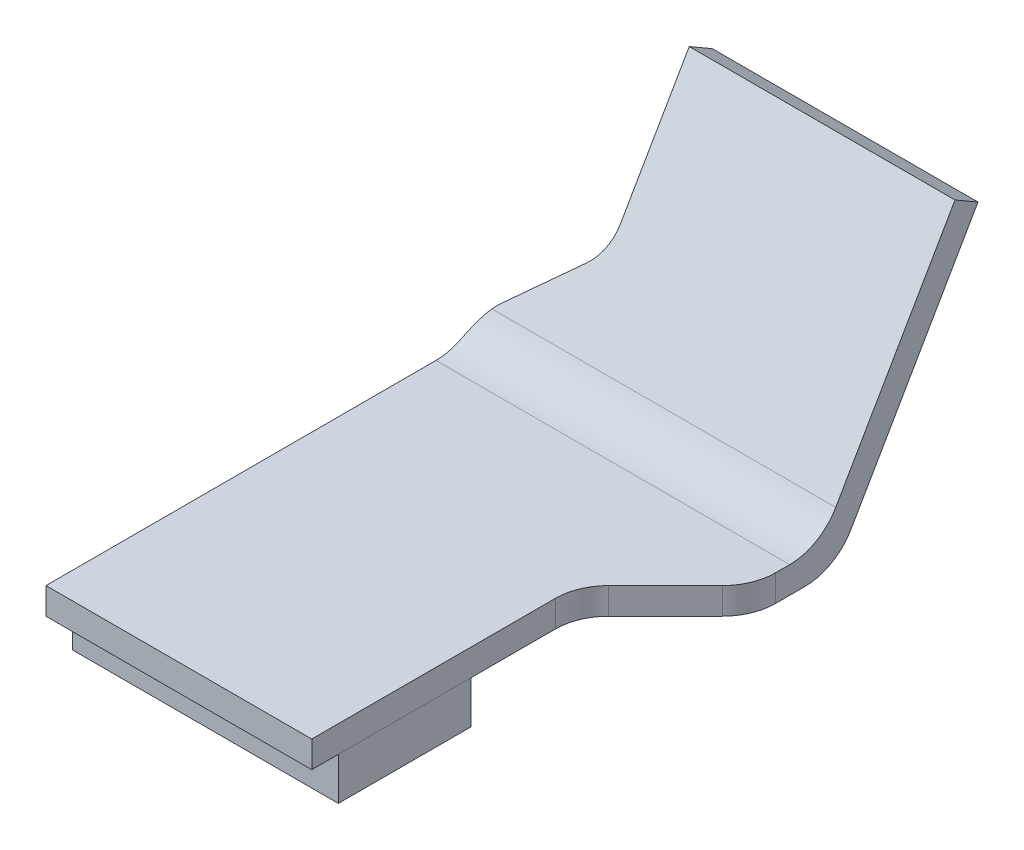
ISO-10303-21;
HEADER;
FILE_DESCRIPTION(('STEP AP214'),'2;1');
FILE_NAME('part.step','',(''),(''),'','','');
FILE_SCHEMA(('AUTOMOTIVE_DESIGN { 1 0 10303 214 1 1 1 1 }'));
ENDSEC;
DATA;
#1=APPLICATION_CONTEXT('core data for automotive mechanical design processes');
#2=APPLICATION_PROTOCOL_DEFINITION('international standard','automotive_design',2000,#1);
#3=PRODUCT_CONTEXT('',#1,'mechanical');
#4=PRODUCT('Part','Part','',(#3));
#5=PRODUCT_RELATED_PRODUCT_CATEGORY('part','',(#4));
#6=PRODUCT_DEFINITION_FORMATION('','',#4);
#7=PRODUCT_DEFINITION_CONTEXT('part definition',#1,'design');
#8=PRODUCT_DEFINITION('design','',#6,#7);
#9=PRODUCT_DEFINITION_SHAPE('','',#8);
#10=(LENGTH_UNIT() NAMED_UNIT(*) SI_UNIT(.MILLI.,.METRE.));
#11=(NAMED_UNIT(*) PLANE_ANGLE_UNIT() SI_UNIT($,.RADIAN.));
#12=(NAMED_UNIT(*) SI_UNIT($,.STERADIAN.) SOLID_ANGLE_UNIT());
#13=UNCERTAINTY_MEASURE_WITH_UNIT(LENGTH_MEASURE(1.E-05),#10,'distance_accuracy_value','');
#14=(GEOMETRIC_REPRESENTATION_CONTEXT(3) GLOBAL_UNCERTAINTY_ASSIGNED_CONTEXT((#13)) GLOBAL_UNIT_ASSIGNED_CONTEXT((#10,
#11,#12)) REPRESENTATION_CONTEXT('',''));
#15=CARTESIAN_POINT('',(0.,0.,0.));
#16=DIRECTION('',(0.,0.,1.));
#17=DIRECTION('',(1.,0.,0.));
#18=AXIS2_PLACEMENT_3D('',#15,#16,#17);
#19=CARTESIAN_POINT('',(0.,-1.6,15.4065524));
#20=DIRECTION('',(1.,0.,0.));
#21=DIRECTION('',(0.,0.,-1.));
#22=AXIS2_PLACEMENT_3D('',#19,#20,#21);
#23=PLANE('',#22);
#24=DIRECTION('',(0.,0.,-1.));
#25=VECTOR('',#24,1.);
#26=CARTESIAN_POINT('',(0.,0.,15.4065524));
#27=LINE('',#26,#25);
#28=CARTESIAN_POINT('',(0.,0.,15.4065524));
#29=VERTEX_POINT('',#28);
#30=CARTESIAN_POINT('',(0.,0.,10.4065524));
#31=VERTEX_POINT('',#30);
#32=EDGE_CURVE('E114',#29,#31,#27,.T.);
#33=ORIENTED_EDGE('',*,*,#32,.T.);
#34=DIRECTION('',(0.,1.,0.));
#35=VECTOR('',#34,1.);
#36=CARTESIAN_POINT('',(0.,-1.6,10.4065524));
#37=LINE('',#36,#35);
#38=CARTESIAN_POINT('',(0.,-1.6,10.4065524));
#39=VERTEX_POINT('',#38);
#40=EDGE_CURVE('E12',#39,#31,#37,.T.);
#41=ORIENTED_EDGE('',*,*,#40,.F.);
#42=DIRECTION('',(0.,0.,-1.));
#43=VECTOR('',#42,1.);
#44=CARTESIAN_POINT('',(0.,-1.6,15.4065524));
#45=LINE('',#44,#43);
#46=CARTESIAN_POINT('',(0.,-1.6,15.4065524));
#47=VERTEX_POINT('',#46);
#48=EDGE_CURVE('E102',#47,#39,#45,.T.);
#49=ORIENTED_EDGE('',*,*,#48,.F.);
#50=DIRECTION('',(0.,1.,0.));
#51=VECTOR('',#50,1.);
#52=CARTESIAN_POINT('',(0.,-1.6,15.4065524));
#53=LINE('',#52,#51);
#54=EDGE_CURVE('E110',#47,#29,#53,.T.);
#55=ORIENTED_EDGE('',*,*,#54,.T.);
#56=EDGE_LOOP('',(#33,#41,#49,#55));
#57=FACE_BOUND('',#56,.T.);
#58=ADVANCED_FACE('F51',(#57),#23,.F.);
#59=CARTESIAN_POINT('',(0.,-1.6,10.4065524));
#60=DIRECTION('',(0.,0.,1.));
#61=DIRECTION('',(1.,0.,0.));
#62=AXIS2_PLACEMENT_3D('',#59,#60,#61);
#63=PLANE('',#62);
#64=DIRECTION('',(1.,0.,0.));
#65=VECTOR('',#64,1.);
#66=CARTESIAN_POINT('',(0.,0.,10.4065524));
#67=LINE('',#66,#65);
#68=CARTESIAN_POINT('',(10.,0.,10.4065524));
#69=VERTEX_POINT('',#68);
#70=EDGE_CURVE('E106',#31,#69,#67,.T.);
#71=ORIENTED_EDGE('',*,*,#70,.T.);
#72=DIRECTION('',(0.,1.,0.));
#73=VECTOR('',#72,1.);
#74=CARTESIAN_POINT('',(10.,-1.6,10.4065524));
#75=LINE('',#74,#73);
#76=CARTESIAN_POINT('',(10.,-1.6,10.4065524));
#77=VERTEX_POINT('',#76);
#78=EDGE_CURVE('E59',#77,#69,#75,.T.);
#79=ORIENTED_EDGE('',*,*,#78,.F.);
#80=DIRECTION('',(1.,0.,0.));
#81=VECTOR('',#80,1.);
#82=CARTESIAN_POINT('',(0.,-1.6,10.4065524));
#83=LINE('',#82,#81);
#84=EDGE_CURVE('E97',#39,#77,#83,.T.);
#85=ORIENTED_EDGE('',*,*,#84,.F.);
#86=ORIENTED_EDGE('',*,*,#40,.T.);
#87=EDGE_LOOP('',(#71,#79,#85,#86));
#88=FACE_BOUND('',#87,.T.);
#89=ADVANCED_FACE('F105',(#88),#63,.F.);
#90=CARTESIAN_POINT('',(10.,-1.6,15.4065524));
#91=DIRECTION('',(-1.,0.,0.));
#92=DIRECTION('',(0.,0.,1.));
#93=AXIS2_PLACEMENT_3D('',#90,#91,#92);
#94=PLANE('',#93);
#95=DIRECTION('',(0.,0.,1.));
#96=VECTOR('',#95,1.);
#97=CARTESIAN_POINT('',(10.,0.,15.4065524));
#98=LINE('',#97,#96);
#99=CARTESIAN_POINT('',(10.,0.,15.4065524));
#100=VERTEX_POINT('',#99);
#101=EDGE_CURVE('E84',#69,#100,#98,.T.);
#102=ORIENTED_EDGE('',*,*,#101,.T.);
#103=DIRECTION('',(0.,1.,0.));
#104=VECTOR('',#103,1.);
#105=CARTESIAN_POINT('',(10.,-1.6,15.4065524));
#106=LINE('',#105,#104);
#107=CARTESIAN_POINT('',(10.,-1.6,15.4065524));
#108=VERTEX_POINT('',#107);
#109=EDGE_CURVE('E107',#108,#100,#106,.T.);
#110=ORIENTED_EDGE('',*,*,#109,.F.);
#111=DIRECTION('',(0.,0.,1.));
#112=VECTOR('',#111,1.);
#113=CARTESIAN_POINT('',(10.,-1.6,15.4065524));
#114=LINE('',#113,#112);
#115=EDGE_CURVE('E100',#77,#108,#114,.T.);
#116=ORIENTED_EDGE('',*,*,#115,.F.);
#117=ORIENTED_EDGE('',*,*,#78,.T.);
#118=EDGE_LOOP('',(#102,#110,#116,#117));
#119=FACE_BOUND('',#118,.T.);
#120=ADVANCED_FACE('F108',(#119),#94,.F.);
#121=CARTESIAN_POINT('',(0.,-1.6,15.4065524));
#122=DIRECTION('',(0.,0.,-1.));
#123=DIRECTION('',(-1.,0.,0.));
#124=AXIS2_PLACEMENT_3D('',#121,#122,#123);
#125=PLANE('',#124);
#126=DIRECTION('',(-1.,0.,0.));
#127=VECTOR('',#126,1.);
#128=CARTESIAN_POINT('',(0.,0.,15.4065524));
#129=LINE('',#128,#127);
#130=EDGE_CURVE('E90',#100,#29,#129,.T.);
#131=ORIENTED_EDGE('',*,*,#130,.T.);
#132=ORIENTED_EDGE('',*,*,#54,.F.);
#133=DIRECTION('',(-1.,0.,0.));
#134=VECTOR('',#133,1.);
#135=CARTESIAN_POINT('',(0.,-1.6,15.4065524));
#136=LINE('',#135,#134);
#137=EDGE_CURVE('E67',#108,#47,#136,.T.);
#138=ORIENTED_EDGE('',*,*,#137,.F.);
#139=ORIENTED_EDGE('',*,*,#109,.T.);
#140=EDGE_LOOP('',(#131,#132,#138,#139));
#141=FACE_BOUND('',#140,.T.);
#142=ADVANCED_FACE('F121',(#141),#125,.F.);
#143=CARTESIAN_POINT('',(0.,-1.6,0.));
#144=DIRECTION('',(0.,-1.,0.));
#145=DIRECTION('',(0.,0.,-1.));
#146=AXIS2_PLACEMENT_3D('',#143,#144,#145);
#147=PLANE('',#146);
#148=ORIENTED_EDGE('',*,*,#48,.T.);
#149=ORIENTED_EDGE('',*,*,#84,.T.);
#150=ORIENTED_EDGE('',*,*,#115,.T.);
#151=ORIENTED_EDGE('',*,*,#137,.T.);
#152=EDGE_LOOP('',(#148,#149,#150,#151));
#153=FACE_BOUND('',#152,.T.);
#154=ADVANCED_FACE('F98',(#153),#147,.T.);
#155=CARTESIAN_POINT('',(0.,0.,0.));
#156=DIRECTION('',(0.,-1.,0.));
#157=DIRECTION('',(0.,0.,-1.));
#158=AXIS2_PLACEMENT_3D('',#155,#156,#157);
#159=PLANE('',#158);
#160=ORIENTED_EDGE('',*,*,#32,.F.);
#161=ORIENTED_EDGE('',*,*,#130,.F.);
#162=ORIENTED_EDGE('',*,*,#101,.F.);
#163=ORIENTED_EDGE('',*,*,#70,.F.);
#164=EDGE_LOOP('',(#160,#161,#162,#163));
#165=FACE_BOUND('',#164,.T.);
#166=ADVANCED_FACE('F124',(#165),#159,.F.);
#167=CLOSED_SHELL('',(#58,#89,#120,#142,#154,#166));
#168=MANIFOLD_SOLID_BREP('B2',#167);
#169=CARTESIAN_POINT('',(13.31,0.999999999999998,0.57735026918963));
#170=DIRECTION('',(0.,-1.,0.));
#171=DIRECTION('',(0.,0.,-1.));
#172=AXIS2_PLACEMENT_3D('',#169,#170,#171);
#173=PLANE('',#172);
#174=DIRECTION('',(0.707106781186543,0.,-0.707106781186552));
#175=VECTOR('',#174,1.);
#176=CARTESIAN_POINT('',(10.,0.999999999999997,6.4065524));
#177=LINE('',#176,#175);
#178=CARTESIAN_POINT('',(10.5857864376269,0.999999999999997,5.8207659623731));
#179=VERTEX_POINT('',#178);
#180=CARTESIAN_POINT('',(12.7242135623731,0.999999999999998,3.68233883762687));
#181=VERTEX_POINT('',#180);
#182=EDGE_CURVE('E451',#179,#181,#177,.T.);
#183=ORIENTED_EDGE('',*,*,#182,.T.);
#184=CARTESIAN_POINT('',(11.31,0.999999999999997,2.26812527525378));
#185=DIRECTION('',(0.,-1.,0.));
#186=DIRECTION('',(0.,0.,-1.));
#187=AXIS2_PLACEMENT_3D('',#184,#185,#186);
#188=CIRCLE('',#187,2.);
#189=CARTESIAN_POINT('',(13.31,0.999999999999997,2.26812527525378));
#190=VERTEX_POINT('',#189);
#191=EDGE_CURVE('E190',#181,#190,#188,.F.);
#192=ORIENTED_EDGE('',*,*,#191,.T.);
#193=DIRECTION('',(0.,0.,1.));
#194=VECTOR('',#193,1.);
#195=CARTESIAN_POINT('',(13.31,0.999999999999998,0.57735026918963));
#196=LINE('',#195,#194);
#197=CARTESIAN_POINT('',(13.31,0.999999999999997,1.73205080756889));
#198=VERTEX_POINT('',#197);
#199=EDGE_CURVE('E476',#198,#190,#196,.T.);
#200=ORIENTED_EDGE('',*,*,#199,.F.);
#201=DIRECTION('',(-1.,0.,0.));
#202=VECTOR('',#201,1.);
#203=CARTESIAN_POINT('',(0.,0.999999999999997,1.73205080756889));
#204=LINE('',#203,#202);
#205=CARTESIAN_POINT('',(0.,0.999999999999997,1.73205080756889));
#206=VERTEX_POINT('',#205);
#207=EDGE_CURVE('E320',#198,#206,#204,.T.);
#208=ORIENTED_EDGE('',*,*,#207,.T.);
#209=DIRECTION('',(0.,0.,1.));
#210=VECTOR('',#209,1.);
#211=CARTESIAN_POINT('',(0.,0.999999999999998,0.57735026918963));
#212=LINE('',#211,#210);
#213=CARTESIAN_POINT('',(0.,0.999999999999996,16.4065524));
#214=VERTEX_POINT('',#213);
#215=EDGE_CURVE('E457',#206,#214,#212,.T.);
#216=ORIENTED_EDGE('',*,*,#215,.T.);
#217=DIRECTION('',(-1.,0.,0.));
#218=VECTOR('',#217,1.);
#219=CARTESIAN_POINT('',(13.31,0.999999999999996,16.4065524));
#220=LINE('',#219,#218);
#221=CARTESIAN_POINT('',(10.,0.999999999999999,16.4065524));
#222=VERTEX_POINT('',#221);
#223=EDGE_CURVE('E321',#222,#214,#220,.T.);
#224=ORIENTED_EDGE('',*,*,#223,.F.);
#225=DIRECTION('',(0.,0.,-1.));
#226=VECTOR('',#225,1.);
#227=CARTESIAN_POINT('',(10.,0.999999999999996,16.4065524));
#228=LINE('',#227,#226);
#229=CARTESIAN_POINT('',(10.,0.999999999999997,7.23497952474619));
#230=VERTEX_POINT('',#229);
#231=EDGE_CURVE('E453',#222,#230,#228,.T.);
#232=ORIENTED_EDGE('',*,*,#231,.T.);
#233=CARTESIAN_POINT('',(12.,0.999999999999997,7.23497952474619));
#234=DIRECTION('',(0.,-1.,0.));
#235=DIRECTION('',(0.,0.,-1.));
#236=AXIS2_PLACEMENT_3D('',#233,#234,#235);
#237=CIRCLE('',#236,2.);
#238=EDGE_CURVE('E49',#230,#179,#237,.T.);
#239=ORIENTED_EDGE('',*,*,#238,.T.);
#240=EDGE_LOOP('',(#183,#192,#200,#208,#216,#224,#232,#239));
#241=FACE_BOUND('',#240,.T.);
#242=ADVANCED_FACE('F174',(#241),#173,.F.);
#243=CARTESIAN_POINT('',(13.31,0.,16.4065524));
#244=DIRECTION('',(0.,0.,-1.));
#245=DIRECTION('',(-1.,0.,0.));
#246=AXIS2_PLACEMENT_3D('',#243,#244,#245);
#247=PLANE('',#246);
#248=DIRECTION('',(0.,-1.,0.));
#249=VECTOR('',#248,1.);
#250=CARTESIAN_POINT('',(10.,14.7154001035333,16.4065524));
#251=LINE('',#250,#249);
#252=CARTESIAN_POINT('',(10.,0.,16.4065524));
#253=VERTEX_POINT('',#252);
#254=EDGE_CURVE('E444',#222,#253,#251,.T.);
#255=ORIENTED_EDGE('',*,*,#254,.F.);
#256=ORIENTED_EDGE('',*,*,#223,.T.);
#257=DIRECTION('',(0.,-1.,0.));
#258=VECTOR('',#257,1.);
#259=CARTESIAN_POINT('',(0.,0.,16.4065524));
#260=LINE('',#259,#258);
#261=CARTESIAN_POINT('',(0.,0.,16.4065524));
#262=VERTEX_POINT('',#261);
#263=EDGE_CURVE('E461',#214,#262,#260,.T.);
#264=ORIENTED_EDGE('',*,*,#263,.T.);
#265=DIRECTION('',(-1.,0.,0.));
#266=VECTOR('',#265,1.);
#267=CARTESIAN_POINT('',(13.31,0.,16.4065524));
#268=LINE('',#267,#266);
#269=EDGE_CURVE('E329',#253,#262,#268,.T.);
#270=ORIENTED_EDGE('',*,*,#269,.F.);
#271=EDGE_LOOP('',(#255,#256,#264,#270));
#272=FACE_BOUND('',#271,.T.);
#273=ADVANCED_FACE('F497',(#272),#247,.F.);
#274=CARTESIAN_POINT('',(13.31,0.,16.4065524));
#275=DIRECTION('',(0.,1.,0.));
#276=DIRECTION('',(0.,0.,1.));
#277=AXIS2_PLACEMENT_3D('',#274,#275,#276);
#278=PLANE('',#277);
#279=DIRECTION('',(0.,0.,-1.));
#280=VECTOR('',#279,1.);
#281=CARTESIAN_POINT('',(13.31,0.,16.4065524));
#282=LINE('',#281,#280);
#283=CARTESIAN_POINT('',(13.31,0.,2.26812527525378));
#284=VERTEX_POINT('',#283);
#285=CARTESIAN_POINT('',(13.31,0.,1.15470053837926));
#286=VERTEX_POINT('',#285);
#287=EDGE_CURVE('E479',#284,#286,#282,.T.);
#288=ORIENTED_EDGE('',*,*,#287,.F.);
#289=CARTESIAN_POINT('',(11.31,0.,2.26812527525378));
#290=DIRECTION('',(0.,1.,0.));
#291=DIRECTION('',(0.,0.,1.));
#292=AXIS2_PLACEMENT_3D('',#289,#290,#291);
#293=CIRCLE('',#292,2.);
#294=CARTESIAN_POINT('',(12.7242135623731,0.,3.68233883762687));
#295=VERTEX_POINT('',#294);
#296=EDGE_CURVE('E198',#284,#295,#293,.F.);
#297=ORIENTED_EDGE('',*,*,#296,.T.);
#298=DIRECTION('',(-0.707106781186543,0.,0.707106781186552));
#299=VECTOR('',#298,1.);
#300=CARTESIAN_POINT('',(10.,0.,6.4065524));
#301=LINE('',#300,#299);
#302=CARTESIAN_POINT('',(10.5857864376269,0.,5.8207659623731));
#303=VERTEX_POINT('',#302);
#304=EDGE_CURVE('E436',#295,#303,#301,.T.);
#305=ORIENTED_EDGE('',*,*,#304,.T.);
#306=CARTESIAN_POINT('',(12.,0.,7.23497952474619));
#307=DIRECTION('',(0.,1.,0.));
#308=DIRECTION('',(0.,0.,1.));
#309=AXIS2_PLACEMENT_3D('',#306,#307,#308);
#310=CIRCLE('',#309,2.);
#311=CARTESIAN_POINT('',(10.,0.,7.23497952474619));
#312=VERTEX_POINT('',#311);
#313=EDGE_CURVE('E183',#303,#312,#310,.T.);
#314=ORIENTED_EDGE('',*,*,#313,.T.);
#315=DIRECTION('',(0.,0.,1.));
#316=VECTOR('',#315,1.);
#317=CARTESIAN_POINT('',(10.,0.,16.4065524));
#318=LINE('',#317,#316);
#319=EDGE_CURVE('E433',#312,#253,#318,.T.);
#320=ORIENTED_EDGE('',*,*,#319,.T.);
#321=ORIENTED_EDGE('',*,*,#269,.T.);
#322=DIRECTION('',(0.,0.,-1.));
#323=VECTOR('',#322,1.);
#324=CARTESIAN_POINT('',(0.,0.,16.4065524));
#325=LINE('',#324,#323);
#326=CARTESIAN_POINT('',(0.,0.,1.15470053837926));
#327=VERTEX_POINT('',#326);
#328=EDGE_CURVE('E473',#262,#327,#325,.T.);
#329=ORIENTED_EDGE('',*,*,#328,.T.);
#330=DIRECTION('',(-1.,0.,0.));
#331=VECTOR('',#330,1.);
#332=CARTESIAN_POINT('',(13.31,0.,1.15470053837926));
#333=LINE('',#332,#331);
#334=EDGE_CURVE('E342',#327,#286,#333,.F.);
#335=ORIENTED_EDGE('',*,*,#334,.T.);
#336=EDGE_LOOP('',(#288,#297,#305,#314,#320,#321,#329,#335));
#337=FACE_BOUND('',#336,.T.);
#338=ADVANCED_FACE('F432',(#337),#278,.F.);
#339=CARTESIAN_POINT('',(13.31,0.,0.));
#340=DIRECTION('',(1.,0.,0.));
#341=DIRECTION('',(0.,0.,-1.));
#342=AXIS2_PLACEMENT_3D('',#339,#340,#341);
#343=PLANE('',#342);
#344=ORIENTED_EDGE('',*,*,#199,.T.);
#345=DIRECTION('',(0.,-1.,0.));
#346=VECTOR('',#345,1.);
#347=CARTESIAN_POINT('',(13.31,0.,2.26812527525378));
#348=LINE('',#347,#346);
#349=EDGE_CURVE('E415',#190,#284,#348,.T.);
#350=ORIENTED_EDGE('',*,*,#349,.T.);
#351=ORIENTED_EDGE('',*,*,#287,.T.);
#352=CARTESIAN_POINT('',(13.31,2.,1.15470053837926));
#353=DIRECTION('',(1.,0.,0.));
#354=DIRECTION('',(0.,0.,-1.));
#355=AXIS2_PLACEMENT_3D('',#352,#353,#354);
#356=CIRCLE('',#355,2.);
#357=CARTESIAN_POINT('',(13.31,1.00000000000001,-0.577350269189625));
#358=VERTEX_POINT('',#357);
#359=EDGE_CURVE('E346',#286,#358,#356,.T.);
#360=ORIENTED_EDGE('',*,*,#359,.T.);
#361=DIRECTION('',(0.,0.86602540378444,-0.499999999999997));
#362=VECTOR('',#361,1.);
#363=CARTESIAN_POINT('',(13.31,0.,0.));
#364=LINE('',#363,#362);
#365=CARTESIAN_POINT('',(13.31,9.27331342118341,-5.35394999999997));
#366=VERTEX_POINT('',#365);
#367=EDGE_CURVE('E482',#358,#366,#364,.T.);
#368=ORIENTED_EDGE('',*,*,#367,.T.);
#369=DIRECTION('',(0.,0.499999999999998,0.86602540378444));
#370=VECTOR('',#369,1.);
#371=CARTESIAN_POINT('',(13.31,9.27331342118341,-5.35394999999997));
#372=LINE('',#371,#370);
#373=CARTESIAN_POINT('',(13.31,9.77331342118341,-4.48792459621553));
#374=VERTEX_POINT('',#373);
#375=EDGE_CURVE('E470',#366,#374,#372,.T.);
#376=ORIENTED_EDGE('',*,*,#375,.T.);
#377=DIRECTION('',(0.,-0.86602540378444,0.499999999999997));
#378=VECTOR('',#377,1.);
#379=CARTESIAN_POINT('',(13.31,9.77331342118341,-4.48792459621553));
#380=LINE('',#379,#378);
#381=CARTESIAN_POINT('',(13.31,2.00000000000001,0.));
#382=VERTEX_POINT('',#381);
#383=EDGE_CURVE('E317',#374,#382,#380,.T.);
#384=ORIENTED_EDGE('',*,*,#383,.T.);
#385=CARTESIAN_POINT('',(13.31,3.,1.73205080756889));
#386=DIRECTION('',(1.,0.,0.));
#387=DIRECTION('',(0.,0.,-1.));
#388=AXIS2_PLACEMENT_3D('',#385,#386,#387);
#389=CIRCLE('',#388,2.);
#390=EDGE_CURVE('E353',#382,#198,#389,.F.);
#391=ORIENTED_EDGE('',*,*,#390,.T.);
#392=EDGE_LOOP('',(#344,#350,#351,#360,#368,#376,#384,#391));
#393=FACE_BOUND('',#392,.T.);
#394=ADVANCED_FACE('F527',(#393),#343,.T.);
#395=CARTESIAN_POINT('',(13.31,9.27331342118341,-5.35394999999997));
#396=DIRECTION('',(0.,-0.86602540378444,0.499999999999998));
#397=DIRECTION('',(0.,-0.499999999999998,-0.86602540378444));
#398=AXIS2_PLACEMENT_3D('',#395,#396,#397);
#399=PLANE('',#398);
#400=DIRECTION('',(-1.,0.,0.));
#401=VECTOR('',#400,1.);
#402=CARTESIAN_POINT('',(13.31,9.27331342118341,-5.35394999999997));
#403=LINE('',#402,#401);
#404=CARTESIAN_POINT('',(3.31,9.27331342118341,-5.35394999999998));
#405=VERTEX_POINT('',#404);
#406=EDGE_CURVE('E310',#366,#405,#403,.T.);
#407=ORIENTED_EDGE('',*,*,#406,.T.);
#408=DIRECTION('',(0.,0.499999999999997,0.86602540378444));
#409=VECTOR('',#408,1.);
#410=CARTESIAN_POINT('',(3.31,4.3328630368561,-13.9110610779281));
#411=LINE('',#410,#409);
#412=CARTESIAN_POINT('',(3.31,9.77331342118341,-4.48792459621553));
#413=VERTEX_POINT('',#412);
#414=EDGE_CURVE('E294',#405,#413,#411,.T.);
#415=ORIENTED_EDGE('',*,*,#414,.T.);
#416=DIRECTION('',(-1.,0.,0.));
#417=VECTOR('',#416,1.);
#418=CARTESIAN_POINT('',(13.31,9.77331342118341,-4.48792459621553));
#419=LINE('',#418,#417);
#420=EDGE_CURVE('E308',#374,#413,#419,.T.);
#421=ORIENTED_EDGE('',*,*,#420,.F.);
#422=ORIENTED_EDGE('',*,*,#375,.F.);
#423=EDGE_LOOP('',(#407,#415,#421,#422));
#424=FACE_BOUND('',#423,.T.);
#425=ADVANCED_FACE('F306',(#424),#399,.F.);
#426=CARTESIAN_POINT('',(13.31,9.77331342118341,-4.48792459621553));
#427=DIRECTION('',(0.,-0.499999999999997,-0.86602540378444));
#428=DIRECTION('',(0.,0.86602540378444,-0.499999999999997));
#429=AXIS2_PLACEMENT_3D('',#426,#427,#428);
#430=PLANE('',#429);
#431=DIRECTION('',(0.707106781186543,0.612372435695799,-0.353553390593274));
#432=VECTOR('',#431,1.);
#433=CARTESIAN_POINT('',(0.,1.71061691195024,0.16707540378446));
#434=LINE('',#433,#432);
#435=CARTESIAN_POINT('',(0.585786437626897,2.21792284812753,-0.12581781502899));
#436=VERTEX_POINT('',#435);
#437=CARTESIAN_POINT('',(2.7242135623731,4.06985506229948,-1.1950313774021));
#438=VERTEX_POINT('',#437);
#439=EDGE_CURVE('E301',#436,#438,#434,.T.);
#440=ORIENTED_EDGE('',*,*,#439,.F.);
#441=CARTESIAN_POINT('',(2.,0.993177976735943,0.581288966157551));
#442=DIRECTION('',(0.,-0.499999999999997,-0.86602540378444));
#443=DIRECTION('',(0.,0.86602540378444,-0.499999999999997));
#444=AXIS2_PLACEMENT_3D('',#441,#442,#443);
#445=CIRCLE('',#444,2.);
#446=CARTESIAN_POINT('',(0.372605594425876,2.,0.));
#447=VERTEX_POINT('',#446);
#448=EDGE_CURVE('E365',#436,#447,#445,.F.);
#449=ORIENTED_EDGE('',*,*,#448,.T.);
#450=DIRECTION('',(-1.,0.,0.));
#451=VECTOR('',#450,1.);
#452=CARTESIAN_POINT('',(13.31,2.,0.));
#453=LINE('',#452,#451);
#454=EDGE_CURVE('E326',#447,#382,#453,.F.);
#455=ORIENTED_EDGE('',*,*,#454,.T.);
#456=ORIENTED_EDGE('',*,*,#383,.F.);
#457=ORIENTED_EDGE('',*,*,#420,.T.);
#458=DIRECTION('',(0.,0.86602540378444,-0.499999999999997));
#459=VECTOR('',#458,1.);
#460=CARTESIAN_POINT('',(3.31,4.57716099847677,-1.48792459621555));
#461=LINE('',#460,#459);
#462=CARTESIAN_POINT('',(3.31,5.29459993369107,-1.90213815858864));
#463=VERTEX_POINT('',#462);
#464=EDGE_CURVE('E290',#463,#413,#461,.T.);
#465=ORIENTED_EDGE('',*,*,#464,.F.);
#466=CARTESIAN_POINT('',(1.31,5.29459993369107,-1.90213815858864));
#467=DIRECTION('',(0.,-0.499999999999997,-0.86602540378444));
#468=DIRECTION('',(0.,0.86602540378444,-0.499999999999997));
#469=AXIS2_PLACEMENT_3D('',#466,#467,#468);
#470=CIRCLE('',#469,2.);
#471=EDGE_CURVE('E422',#463,#438,#470,.T.);
#472=ORIENTED_EDGE('',*,*,#471,.T.);
#473=EDGE_LOOP('',(#440,#449,#455,#456,#457,#465,#472));
#474=FACE_BOUND('',#473,.T.);
#475=ADVANCED_FACE('F315',(#474),#430,.F.);
#476=CARTESIAN_POINT('',(13.31,0.,0.));
#477=DIRECTION('',(0.,0.499999999999997,0.86602540378444));
#478=DIRECTION('',(0.,-0.86602540378444,0.499999999999997));
#479=AXIS2_PLACEMENT_3D('',#476,#477,#478);
#480=PLANE('',#479);
#481=DIRECTION('',(-1.,0.,0.));
#482=VECTOR('',#481,1.);
#483=CARTESIAN_POINT('',(13.31,1.00000000000001,-0.577350269189625));
#484=LINE('',#483,#482);
#485=CARTESIAN_POINT('',(0.0875386063209798,1.00000000000001,-0.577350269189624));
#486=VERTEX_POINT('',#485);
#487=EDGE_CURVE('E335',#358,#486,#484,.T.);
#488=ORIENTED_EDGE('',*,*,#487,.T.);
#489=CARTESIAN_POINT('',(2.,0.493177976735946,-0.28473643762689));
#490=DIRECTION('',(0.,0.499999999999997,0.86602540378444));
#491=DIRECTION('',(0.,-0.86602540378444,0.499999999999997));
#492=AXIS2_PLACEMENT_3D('',#489,#490,#491);
#493=CIRCLE('',#492,2.);
#494=CARTESIAN_POINT('',(0.585786437626897,1.71792284812753,-0.991843218813429));
#495=VERTEX_POINT('',#494);
#496=EDGE_CURVE('E402',#486,#495,#493,.F.);
#497=ORIENTED_EDGE('',*,*,#496,.T.);
#498=DIRECTION('',(-0.707106781186543,-0.612372435695799,0.353553390593274));
#499=VECTOR('',#498,1.);
#500=CARTESIAN_POINT('',(0.,1.21061691195024,-0.698949999999979));
#501=LINE('',#500,#499);
#502=CARTESIAN_POINT('',(2.7242135623731,3.56985506229948,-2.06105678118654));
#503=VERTEX_POINT('',#502);
#504=EDGE_CURVE('E312',#503,#495,#501,.T.);
#505=ORIENTED_EDGE('',*,*,#504,.F.);
#506=CARTESIAN_POINT('',(1.31,4.79459993369107,-2.76816356237308));
#507=DIRECTION('',(0.,0.499999999999997,0.86602540378444));
#508=DIRECTION('',(0.,-0.86602540378444,0.499999999999997));
#509=AXIS2_PLACEMENT_3D('',#506,#507,#508);
#510=CIRCLE('',#509,2.);
#511=CARTESIAN_POINT('',(3.31,4.79459993369107,-2.76816356237308));
#512=VERTEX_POINT('',#511);
#513=EDGE_CURVE('E425',#503,#512,#510,.T.);
#514=ORIENTED_EDGE('',*,*,#513,.T.);
#515=DIRECTION('',(0.,-0.86602540378444,0.499999999999997));
#516=VECTOR('',#515,1.);
#517=CARTESIAN_POINT('',(3.31,4.07716099847677,-2.35394999999999));
#518=LINE('',#517,#516);
#519=EDGE_CURVE('E466',#405,#512,#518,.T.);
#520=ORIENTED_EDGE('',*,*,#519,.F.);
#521=ORIENTED_EDGE('',*,*,#406,.F.);
#522=ORIENTED_EDGE('',*,*,#367,.F.);
#523=EDGE_LOOP('',(#488,#497,#505,#514,#520,#521,#522));
#524=FACE_BOUND('',#523,.T.);
#525=ADVANCED_FACE('F513',(#524),#480,.F.);
#526=CARTESIAN_POINT('',(0.,0.,0.));
#527=DIRECTION('',(1.,0.,0.));
#528=DIRECTION('',(0.,0.,-1.));
#529=AXIS2_PLACEMENT_3D('',#526,#527,#528);
#530=PLANE('',#529);
#531=CARTESIAN_POINT('',(0.,3.,1.73205080756889));
#532=DIRECTION('',(1.,0.,0.));
#533=DIRECTION('',(0.,0.,-1.));
#534=AXIS2_PLACEMENT_3D('',#531,#532,#533);
#535=CIRCLE('',#534,2.);
#536=CARTESIAN_POINT('',(0.,1.17948077394888,0.90397487652256));
#537=VERTEX_POINT('',#536);
#538=EDGE_CURVE('E349',#206,#537,#535,.T.);
#539=ORIENTED_EDGE('',*,*,#538,.T.);
#540=DIRECTION('',(0.,0.499999999999997,0.86602540378444));
#541=VECTOR('',#540,1.);
#542=CARTESIAN_POINT('',(0.,0.493177976735945,-0.284736437626891));
#543=LINE('',#542,#541);
#544=CARTESIAN_POINT('',(0.,0.536947279896435,-0.208925780741038));
#545=VERTEX_POINT('',#544);
#546=EDGE_CURVE('E377',#537,#545,#543,.F.);
#547=ORIENTED_EDGE('',*,*,#546,.T.);
#548=CARTESIAN_POINT('',(0.,2.,1.15470053837926));
#549=DIRECTION('',(1.,0.,0.));
#550=DIRECTION('',(0.,0.,-1.));
#551=AXIS2_PLACEMENT_3D('',#548,#549,#550);
#552=CIRCLE('',#551,2.);
#553=EDGE_CURVE('E339',#545,#327,#552,.F.);
#554=ORIENTED_EDGE('',*,*,#553,.T.);
#555=ORIENTED_EDGE('',*,*,#328,.F.);
#556=ORIENTED_EDGE('',*,*,#263,.F.);
#557=ORIENTED_EDGE('',*,*,#215,.F.);
#558=EDGE_LOOP('',(#539,#547,#554,#555,#556,#557));
#559=FACE_BOUND('',#558,.T.);
#560=ADVANCED_FACE('F500',(#559),#530,.F.);
#561=CARTESIAN_POINT('',(10.,14.7154001035333,16.4065524));
#562=DIRECTION('',(1.,0.,0.));
#563=DIRECTION('',(0.,0.,-1.));
#564=AXIS2_PLACEMENT_3D('',#561,#562,#563);
#565=PLANE('',#564);
#566=ORIENTED_EDGE('',*,*,#319,.F.);
#567=DIRECTION('',(0.,-1.,0.));
#568=VECTOR('',#567,1.);
#569=CARTESIAN_POINT('',(10.,0.999999999999997,7.23497952474619));
#570=LINE('',#569,#568);
#571=EDGE_CURVE('E412',#312,#230,#570,.F.);
#572=ORIENTED_EDGE('',*,*,#571,.T.);
#573=ORIENTED_EDGE('',*,*,#231,.F.);
#574=ORIENTED_EDGE('',*,*,#254,.T.);
#575=EDGE_LOOP('',(#566,#572,#573,#574));
#576=FACE_BOUND('',#575,.T.);
#577=ADVANCED_FACE('F441',(#576),#565,.T.);
#578=CARTESIAN_POINT('',(10.,14.7154001035333,6.4065524));
#579=DIRECTION('',(0.707106781186552,0.,0.707106781186543));
#580=DIRECTION('',(0.707106781186543,0.,-0.707106781186552));
#581=AXIS2_PLACEMENT_3D('',#578,#579,#580);
#582=PLANE('',#581);
#583=ORIENTED_EDGE('',*,*,#182,.F.);
#584=DIRECTION('',(0.,-1.,0.));
#585=VECTOR('',#584,1.);
#586=CARTESIAN_POINT('',(10.5857864376269,0.,5.8207659623731));
#587=LINE('',#586,#585);
#588=EDGE_CURVE('E408',#179,#303,#587,.T.);
#589=ORIENTED_EDGE('',*,*,#588,.T.);
#590=ORIENTED_EDGE('',*,*,#304,.F.);
#591=DIRECTION('',(0.,-1.,0.));
#592=VECTOR('',#591,1.);
#593=CARTESIAN_POINT('',(12.7242135623731,14.7154001035333,3.68233883762687));
#594=LINE('',#593,#592);
#595=EDGE_CURVE('E405',#295,#181,#594,.F.);
#596=ORIENTED_EDGE('',*,*,#595,.T.);
#597=EDGE_LOOP('',(#583,#589,#590,#596));
#598=FACE_BOUND('',#597,.T.);
#599=ADVANCED_FACE('F455',(#598),#582,.T.);
#600=CARTESIAN_POINT('',(3.31,-0.863289385850543,-10.9110610779281));
#601=DIRECTION('',(1.,0.,0.));
#602=DIRECTION('',(0.,0.,-1.));
#603=AXIS2_PLACEMENT_3D('',#600,#601,#602);
#604=PLANE('',#603);
#605=ORIENTED_EDGE('',*,*,#519,.T.);
#606=DIRECTION('',(0.,0.499999999999997,0.86602540378444));
#607=VECTOR('',#606,1.);
#608=CARTESIAN_POINT('',(3.31,5.29459993369107,-1.90213815858864));
#609=LINE('',#608,#607);
#610=EDGE_CURVE('E297',#512,#463,#609,.T.);
#611=ORIENTED_EDGE('',*,*,#610,.T.);
#612=ORIENTED_EDGE('',*,*,#464,.T.);
#613=ORIENTED_EDGE('',*,*,#414,.F.);
#614=EDGE_LOOP('',(#605,#611,#612,#613));
#615=FACE_BOUND('',#614,.T.);
#616=ADVANCED_FACE('F293',(#615),#604,.F.);
#617=CARTESIAN_POINT('',(0.,-3.72983347237707,-9.25606107792814));
#618=DIRECTION('',(0.707106781186552,-0.612372435695792,0.35355339059327));
#619=DIRECTION('',(0.654653670707973,0.755928946018458,0.));
#620=AXIS2_PLACEMENT_3D('',#617,#618,#619);
#621=PLANE('',#620);
#622=ORIENTED_EDGE('',*,*,#439,.T.);
#623=DIRECTION('',(0.,0.499999999999997,0.86602540378444));
#624=VECTOR('',#623,1.);
#625=CARTESIAN_POINT('',(2.7242135623731,3.56985506229949,-2.06105678118654));
#626=LINE('',#625,#624);
#627=EDGE_CURVE('E362',#438,#503,#626,.F.);
#628=ORIENTED_EDGE('',*,*,#627,.T.);
#629=ORIENTED_EDGE('',*,*,#504,.T.);
#630=DIRECTION('',(0.,0.499999999999997,0.86602540378444));
#631=VECTOR('',#630,1.);
#632=CARTESIAN_POINT('',(0.585786437626896,-3.22252753619978,-9.54895429674158));
#633=LINE('',#632,#631);
#634=EDGE_CURVE('E358',#495,#436,#633,.T.);
#635=ORIENTED_EDGE('',*,*,#634,.T.);
#636=EDGE_LOOP('',(#622,#628,#629,#635));
#637=FACE_BOUND('',#636,.T.);
#638=ADVANCED_FACE('F388',(#637),#621,.F.);
#639=CARTESIAN_POINT('',(13.31,3.,1.73205080756889));
#640=DIRECTION('',(1.,0.,0.));
#641=DIRECTION('',(0.,0.,-1.));
#642=AXIS2_PLACEMENT_3D('',#639,#640,#641);
#643=CYLINDRICAL_SURFACE('',#642,2.);
#644=ORIENTED_EDGE('',*,*,#454,.F.);
#645=CARTESIAN_POINT('',(0.372605594425876,2.,0.));
#646=CARTESIAN_POINT('',(0.347614204474395,1.96971174649541,0.0174817878079042));
#647=CARTESIAN_POINT('',(0.323756221598083,1.93917544417048,0.0361763486309518));
#648=CARTESIAN_POINT('',(0.278426675588734,1.87793400290943,0.0760617796328089));
#649=CARTESIAN_POINT('',(0.256956323895448,1.84722878648612,0.0972539058995854));
#650=CARTESIAN_POINT('',(0.216580770202335,1.78605899181345,0.142150317896857));
#651=CARTESIAN_POINT('',(0.197671360140936,1.75559409821159,0.165850365645608));
#652=CARTESIAN_POINT('',(0.162476256787222,1.6952382958977,0.215761263157289));
#653=CARTESIAN_POINT('',(0.146189981820216,1.66534726123214,0.241971554217722));
#654=CARTESIAN_POINT('',(0.101244429628791,1.57685729138223,0.324514286130428));
#655=CARTESIAN_POINT('',(0.076619561952696,1.51962801465992,0.384624568629687));
#656=CARTESIAN_POINT('',(0.0380129971070813,1.41186841468375,0.513490717948977));
#657=CARTESIAN_POINT('',(0.0240216176375101,1.36133203194261,0.582238653130541));
#658=CARTESIAN_POINT('',(0.00961582972399008,1.28974847674542,0.69412742733489));
#659=CARTESIAN_POINT('',(0.0059273865943433,1.26562812356649,0.734953360755372));
#660=CARTESIAN_POINT('',(0.00111968978974275,1.22031906590715,0.818275982039954));
#661=CARTESIAN_POINT('',(-3.09276393865708E-06,1.19912637241069,0.860770293188852));
#662=CARTESIAN_POINT('',(0.,1.17948077394888,0.90397487652256));
#663=B_SPLINE_CURVE_WITH_KNOTS('',3,(#645,#646,#647,#648,#649,#650,#651,#652,#653,#654,#655,
#656,#657,#658,#659,#660,#661,#662),.UNSPECIFIED.,.F.,.F.,(4,2,2,2,2,2,2,2,4),(0.,
0.128930460186582,0.257926041669575,0.386707020975038,0.51545940393543,0.773732601133735,
1.03177034553288,1.17428681526187,1.31660714570319),.UNSPECIFIED.);
#664=EDGE_CURVE('E368',#447,#537,#663,.T.);
#665=ORIENTED_EDGE('',*,*,#664,.T.);
#666=ORIENTED_EDGE('',*,*,#538,.F.);
#667=ORIENTED_EDGE('',*,*,#207,.F.);
#668=ORIENTED_EDGE('',*,*,#390,.F.);
#669=EDGE_LOOP('',(#644,#665,#666,#667,#668));
#670=FACE_BOUND('',#669,.T.);
#671=ADVANCED_FACE('F382',(#670),#643,.F.);
#672=CARTESIAN_POINT('',(13.31,2.,1.15470053837926));
#673=DIRECTION('',(-1.,0.,0.));
#674=DIRECTION('',(0.,0.,1.));
#675=AXIS2_PLACEMENT_3D('',#672,#673,#674);
#676=CYLINDRICAL_SURFACE('',#675,2.);
#677=ORIENTED_EDGE('',*,*,#553,.F.);
#678=CARTESIAN_POINT('',(0.,0.536947279896435,-0.208925780741037));
#679=CARTESIAN_POINT('',(-8.13949014447449E-06,0.564876980519107,-0.238904339071631));
#680=CARTESIAN_POINT('',(0.00115083495256573,0.593743188220274,-0.268016738248605));
#681=CARTESIAN_POINT('',(0.00587914021806808,0.653115440060411,-0.324342440060327));
#682=CARTESIAN_POINT('',(0.00944978380273116,0.683622368976995,-0.351554699471631));
#683=CARTESIAN_POINT('',(0.0189944486562825,0.745472253506204,-0.403427676055977));
#684=CARTESIAN_POINT('',(0.0249258237655154,0.776791616136041,-0.428124389958677));
#685=CARTESIAN_POINT('',(0.0392020441092042,0.84046954785269,-0.475347957772853));
#686=CARTESIAN_POINT('',(0.0475452458313712,0.872827395971294,-0.497876275425248));
#687=CARTESIAN_POINT('',(0.061610311441843,0.921116458364457,-0.529448009459288));
#688=CARTESIAN_POINT('',(0.0664099149954013,0.936756259974448,-0.539363506875309));
#689=CARTESIAN_POINT('',(0.0765625700294232,0.968244267747426,-0.558723819361182));
#690=CARTESIAN_POINT('',(0.0819178524312808,0.984093071983671,-0.568166492254127));
#691=CARTESIAN_POINT('',(0.0875386063209798,1.00000000000001,-0.577350269189625));
#692=B_SPLINE_CURVE_WITH_KNOTS('',3,(#678,#679,#680,#681,#682,#683,#684,#685,#686,#687,#688,
#689,#690,#691),.UNSPECIFIED.,.F.,.F.,(4,2,2,2,2,2,4),(0.,0.122890127793384,0.245847203256822,
0.366677166674541,0.487424985180581,0.544802475196572,0.602419956219673),.UNSPECIFIED.);
#693=EDGE_CURVE('E395',#545,#486,#692,.T.);
#694=ORIENTED_EDGE('',*,*,#693,.T.);
#695=ORIENTED_EDGE('',*,*,#487,.F.);
#696=ORIENTED_EDGE('',*,*,#359,.F.);
#697=ORIENTED_EDGE('',*,*,#334,.F.);
#698=EDGE_LOOP('',(#677,#694,#695,#696,#697));
#699=FACE_BOUND('',#698,.T.);
#700=ADVANCED_FACE('F387',(#699),#676,.T.);
#701=CARTESIAN_POINT('',(1.31,-0.145850450636246,-11.3252746403012));
#702=DIRECTION('',(0.,-0.499999999999997,-0.86602540378444));
#703=DIRECTION('',(0.,0.86602540378444,-0.499999999999997));
#704=AXIS2_PLACEMENT_3D('',#701,#702,#703);
#705=CYLINDRICAL_SURFACE('',#704,2.);
#706=ORIENTED_EDGE('',*,*,#513,.F.);
#707=ORIENTED_EDGE('',*,*,#627,.F.);
#708=ORIENTED_EDGE('',*,*,#471,.F.);
#709=ORIENTED_EDGE('',*,*,#610,.F.);
#710=EDGE_LOOP('',(#706,#707,#708,#709));
#711=FACE_BOUND('',#710,.T.);
#712=ADVANCED_FACE('F393',(#711),#705,.F.);
#713=CARTESIAN_POINT('',(2.,-4.44727240759137,-8.84184751555505));
#714=DIRECTION('',(0.,0.499999999999997,0.86602540378444));
#715=DIRECTION('',(0.,-0.86602540378444,0.499999999999997));
#716=AXIS2_PLACEMENT_3D('',#713,#714,#715);
#717=CYLINDRICAL_SURFACE('',#716,2.);
#718=ORIENTED_EDGE('',*,*,#693,.F.);
#719=ORIENTED_EDGE('',*,*,#546,.F.);
#720=ORIENTED_EDGE('',*,*,#664,.F.);
#721=ORIENTED_EDGE('',*,*,#448,.F.);
#722=ORIENTED_EDGE('',*,*,#634,.F.);
#723=ORIENTED_EDGE('',*,*,#496,.F.);
#724=EDGE_LOOP('',(#718,#719,#720,#721,#722,#723));
#725=FACE_BOUND('',#724,.T.);
#726=ADVANCED_FACE('F379',(#725),#717,.T.);
#727=CARTESIAN_POINT('',(12.,14.7154001035333,7.23497952474619));
#728=DIRECTION('',(0.,1.,0.));
#729=DIRECTION('',(0.,0.,1.));
#730=AXIS2_PLACEMENT_3D('',#727,#728,#729);
#731=CYLINDRICAL_SURFACE('',#730,2.);
#732=ORIENTED_EDGE('',*,*,#238,.F.);
#733=ORIENTED_EDGE('',*,*,#571,.F.);
#734=ORIENTED_EDGE('',*,*,#313,.F.);
#735=ORIENTED_EDGE('',*,*,#588,.F.);
#736=EDGE_LOOP('',(#732,#733,#734,#735));
#737=FACE_BOUND('',#736,.T.);
#738=ADVANCED_FACE('F449',(#737),#731,.F.);
#739=CARTESIAN_POINT('',(11.31,0.,2.26812527525378));
#740=DIRECTION('',(0.,-1.,0.));
#741=DIRECTION('',(0.,0.,-1.));
#742=AXIS2_PLACEMENT_3D('',#739,#740,#741);
#743=CYLINDRICAL_SURFACE('',#742,2.);
#744=ORIENTED_EDGE('',*,*,#191,.F.);
#745=ORIENTED_EDGE('',*,*,#595,.F.);
#746=ORIENTED_EDGE('',*,*,#296,.F.);
#747=ORIENTED_EDGE('',*,*,#349,.F.);
#748=EDGE_LOOP('',(#744,#745,#746,#747));
#749=FACE_BOUND('',#748,.T.);
#750=ADVANCED_FACE('F176',(#749),#743,.T.);
#751=CLOSED_SHELL('',(#242,#273,#338,#394,#425,#475,#525,#560,#577,#599,#616,#638,#671,#700,
#712,#726,#738,#750));
#752=MANIFOLD_SOLID_BREP('B6',#751);
#753=ADVANCED_BREP_SHAPE_REPRESENTATION('',(#18,#168,#752),#14);
#754=SHAPE_DEFINITION_REPRESENTATION(#9,#753);
ENDSEC;
END-ISO-10303-21;
